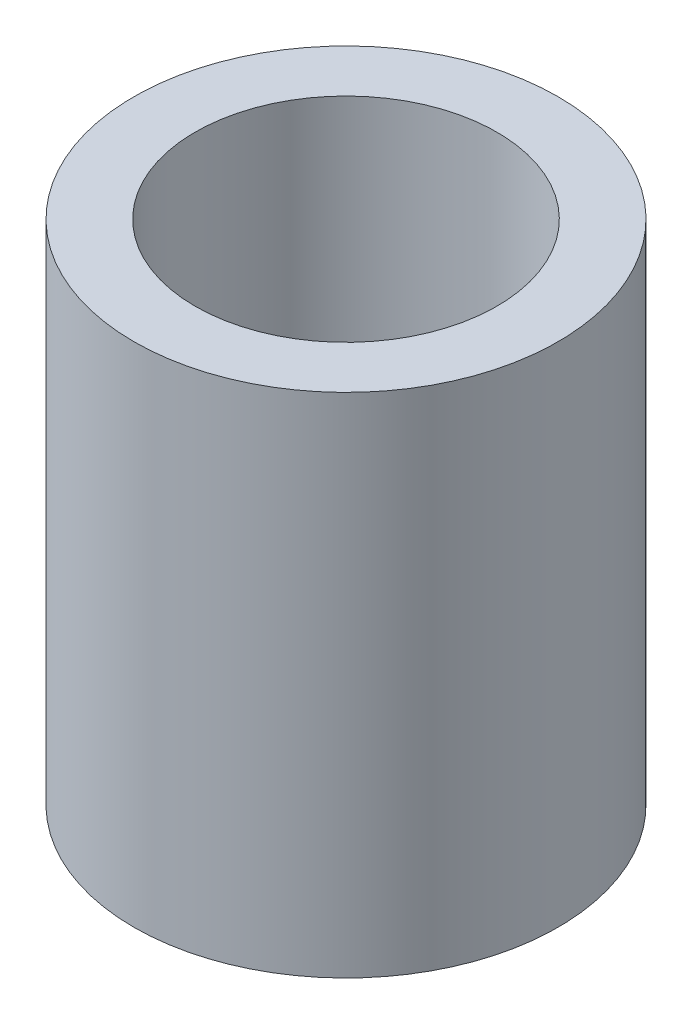
ISO-10303-21;
HEADER;
FILE_DESCRIPTION(('STEP AP214'),'2;1');
FILE_NAME('part.step','',(''),(''),'','','');
FILE_SCHEMA(('AUTOMOTIVE_DESIGN { 1 0 10303 214 1 1 1 1 }'));
ENDSEC;
DATA;
#1=APPLICATION_CONTEXT('core data for automotive mechanical design processes');
#2=APPLICATION_PROTOCOL_DEFINITION('international standard','automotive_design',2000,#1);
#3=PRODUCT_CONTEXT('',#1,'mechanical');
#4=PRODUCT('Part','Part','',(#3));
#5=PRODUCT_RELATED_PRODUCT_CATEGORY('part','',(#4));
#6=PRODUCT_DEFINITION_FORMATION('','',#4);
#7=PRODUCT_DEFINITION_CONTEXT('part definition',#1,'design');
#8=PRODUCT_DEFINITION('design','',#6,#7);
#9=PRODUCT_DEFINITION_SHAPE('','',#8);
#10=(LENGTH_UNIT() NAMED_UNIT(*) SI_UNIT(.MILLI.,.METRE.));
#11=(NAMED_UNIT(*) PLANE_ANGLE_UNIT() SI_UNIT($,.RADIAN.));
#12=(NAMED_UNIT(*) SI_UNIT($,.STERADIAN.) SOLID_ANGLE_UNIT());
#13=UNCERTAINTY_MEASURE_WITH_UNIT(LENGTH_MEASURE(1.E-05),#10,'distance_accuracy_value','');
#14=(GEOMETRIC_REPRESENTATION_CONTEXT(3) GLOBAL_UNCERTAINTY_ASSIGNED_CONTEXT((#13)) GLOBAL_UNIT_ASSIGNED_CONTEXT((#10,
#11,#12)) REPRESENTATION_CONTEXT('',''));
#15=CARTESIAN_POINT('',(0.,0.,0.));
#16=DIRECTION('',(0.,0.,1.));
#17=DIRECTION('',(1.,0.,0.));
#18=AXIS2_PLACEMENT_3D('',#15,#16,#17);
#19=CARTESIAN_POINT('',(0.,5.379,0.));
#20=DIRECTION('',(0.,1.,0.));
#21=DIRECTION('',(0.,0.,1.));
#22=AXIS2_PLACEMENT_3D('',#19,#20,#21);
#23=PLANE('',#22);
#24=CARTESIAN_POINT('',(0.,5.379,0.));
#25=DIRECTION('',(0.,1.,0.));
#26=DIRECTION('',(0.,0.,1.));
#27=AXIS2_PLACEMENT_3D('',#24,#25,#26);
#28=CIRCLE('',#27,2.25);
#29=CARTESIAN_POINT('',(0.,5.379,2.25));
#30=VERTEX_POINT('',#29);
#31=EDGE_CURVE('E10',#30,#30,#28,.T.);
#32=ORIENTED_EDGE('',*,*,#31,.T.);
#33=EDGE_LOOP('',(#32));
#34=FACE_BOUND('',#33,.T.);
#35=CARTESIAN_POINT('',(0.,5.379,0.));
#36=DIRECTION('',(0.,1.,0.));
#37=DIRECTION('',(0.,0.,1.));
#38=AXIS2_PLACEMENT_3D('',#35,#36,#37);
#39=CIRCLE('',#38,1.6);
#40=CARTESIAN_POINT('',(0.,5.379,1.6));
#41=VERTEX_POINT('',#40);
#42=EDGE_CURVE('E42',#41,#41,#39,.T.);
#43=ORIENTED_EDGE('',*,*,#42,.F.);
#44=EDGE_LOOP('',(#43));
#45=FACE_BOUND('',#44,.T.);
#46=ADVANCED_FACE('F31',(#34,#45),#23,.T.);
#47=CARTESIAN_POINT('',(0.,0.,0.));
#48=DIRECTION('',(0.,1.,0.));
#49=DIRECTION('',(0.,0.,1.));
#50=AXIS2_PLACEMENT_3D('',#47,#48,#49);
#51=PLANE('',#50);
#52=CARTESIAN_POINT('',(0.,0.,0.));
#53=DIRECTION('',(0.,1.,0.));
#54=DIRECTION('',(0.,0.,1.));
#55=AXIS2_PLACEMENT_3D('',#52,#53,#54);
#56=CIRCLE('',#55,2.25);
#57=CARTESIAN_POINT('',(0.,0.,2.25));
#58=VERTEX_POINT('',#57);
#59=EDGE_CURVE('E35',#58,#58,#56,.T.);
#60=ORIENTED_EDGE('',*,*,#59,.F.);
#61=EDGE_LOOP('',(#60));
#62=FACE_BOUND('',#61,.T.);
#63=CARTESIAN_POINT('',(0.,0.,0.));
#64=DIRECTION('',(0.,1.,0.));
#65=DIRECTION('',(0.,0.,1.));
#66=AXIS2_PLACEMENT_3D('',#63,#64,#65);
#67=CIRCLE('',#66,1.6);
#68=CARTESIAN_POINT('',(0.,0.,1.6));
#69=VERTEX_POINT('',#68);
#70=EDGE_CURVE('E44',#69,#69,#67,.T.);
#71=ORIENTED_EDGE('',*,*,#70,.T.);
#72=EDGE_LOOP('',(#71));
#73=FACE_BOUND('',#72,.T.);
#74=ADVANCED_FACE('F54',(#62,#73),#51,.F.);
#75=CARTESIAN_POINT('',(0.,5.379,0.));
#76=DIRECTION('',(0.,-1.,0.));
#77=DIRECTION('',(0.,0.,-1.));
#78=AXIS2_PLACEMENT_3D('',#75,#76,#77);
#79=CYLINDRICAL_SURFACE('',#78,2.25);
#80=ORIENTED_EDGE('',*,*,#31,.F.);
#81=EDGE_LOOP('',(#80));
#82=FACE_BOUND('',#81,.T.);
#83=ORIENTED_EDGE('',*,*,#59,.T.);
#84=EDGE_LOOP('',(#83));
#85=FACE_BOUND('',#84,.T.);
#86=ADVANCED_FACE('F33',(#82,#85),#79,.T.);
#87=CARTESIAN_POINT('',(0.,5.379,0.));
#88=DIRECTION('',(0.,-1.,0.));
#89=DIRECTION('',(0.,0.,-1.));
#90=AXIS2_PLACEMENT_3D('',#87,#88,#89);
#91=CYLINDRICAL_SURFACE('',#90,1.6);
#92=ORIENTED_EDGE('',*,*,#42,.T.);
#93=EDGE_LOOP('',(#92));
#94=FACE_BOUND('',#93,.T.);
#95=ORIENTED_EDGE('',*,*,#70,.F.);
#96=EDGE_LOOP('',(#95));
#97=FACE_BOUND('',#96,.T.);
#98=ADVANCED_FACE('F50',(#94,#97),#91,.F.);
#99=CLOSED_SHELL('',(#46,#74,#86,#98));
#100=MANIFOLD_SOLID_BREP('B2',#99);
#101=ADVANCED_BREP_SHAPE_REPRESENTATION('',(#18,#100),#14);
#102=SHAPE_DEFINITION_REPRESENTATION(#9,#101);
ENDSEC;
END-ISO-10303-21;
